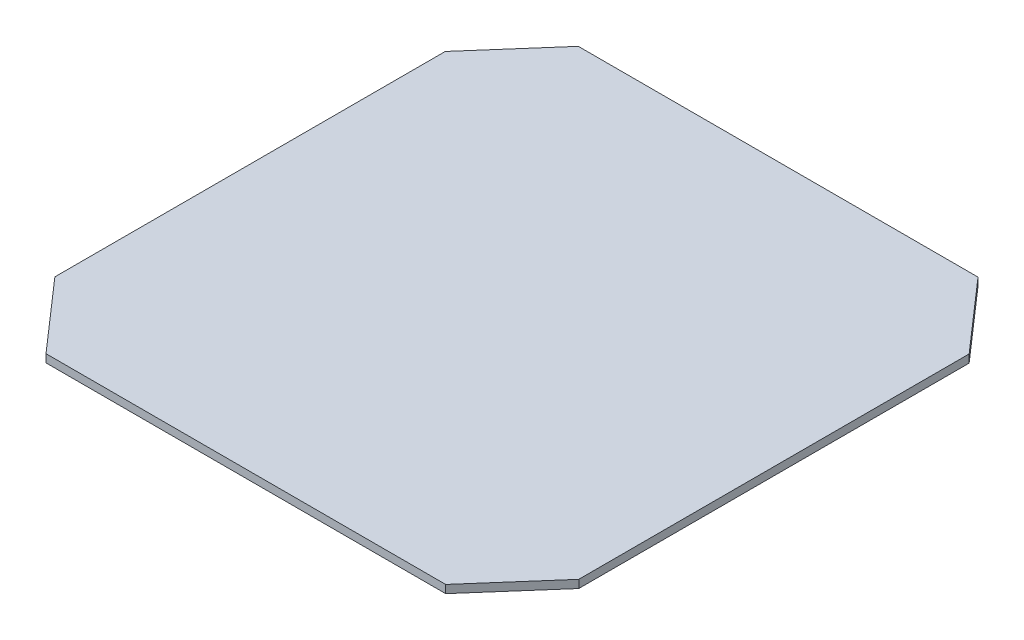
ISO-10303-21;
HEADER;
FILE_DESCRIPTION(('STEP AP214'),'2;1');
FILE_NAME('part.step','',(''),(''),'','','');
FILE_SCHEMA(('AUTOMOTIVE_DESIGN { 1 0 10303 214 1 1 1 1 }'));
ENDSEC;
DATA;
#1=APPLICATION_CONTEXT('core data for automotive mechanical design processes');
#2=APPLICATION_PROTOCOL_DEFINITION('international standard','automotive_design',2000,#1);
#3=PRODUCT_CONTEXT('',#1,'mechanical');
#4=PRODUCT('Part','Part','',(#3));
#5=PRODUCT_RELATED_PRODUCT_CATEGORY('part','',(#4));
#6=PRODUCT_DEFINITION_FORMATION('','',#4);
#7=PRODUCT_DEFINITION_CONTEXT('part definition',#1,'design');
#8=PRODUCT_DEFINITION('design','',#6,#7);
#9=PRODUCT_DEFINITION_SHAPE('','',#8);
#10=(LENGTH_UNIT() NAMED_UNIT(*) SI_UNIT(.MILLI.,.METRE.));
#11=(NAMED_UNIT(*) PLANE_ANGLE_UNIT() SI_UNIT($,.RADIAN.));
#12=(NAMED_UNIT(*) SI_UNIT($,.STERADIAN.) SOLID_ANGLE_UNIT());
#13=UNCERTAINTY_MEASURE_WITH_UNIT(LENGTH_MEASURE(1.E-05),#10,'distance_accuracy_value','');
#14=(GEOMETRIC_REPRESENTATION_CONTEXT(3) GLOBAL_UNCERTAINTY_ASSIGNED_CONTEXT((#13)) GLOBAL_UNIT_ASSIGNED_CONTEXT((#10,
#11,#12)) REPRESENTATION_CONTEXT('',''));
#15=CARTESIAN_POINT('',(0.,0.,0.));
#16=DIRECTION('',(0.,0.,1.));
#17=DIRECTION('',(1.,0.,0.));
#18=AXIS2_PLACEMENT_3D('',#15,#16,#17);
#19=CARTESIAN_POINT('',(-163.846153846154,5.,122.087912087912));
#20=DIRECTION('',(0.752576694706879,0.,-0.658504607868517));
#21=DIRECTION('',(-0.658504607868517,0.,-0.752576694706879));
#22=AXIS2_PLACEMENT_3D('',#19,#20,#21);
#23=PLANE('',#22);
#24=DIRECTION('',(0.658504607868517,0.,0.752576694706879));
#25=VECTOR('',#24,1.);
#26=CARTESIAN_POINT('',(-163.846153846154,0.,122.087912087912));
#27=LINE('',#26,#25);
#28=CARTESIAN_POINT('',(-163.846153846154,0.,122.087912087912));
#29=VERTEX_POINT('',#28);
#30=CARTESIAN_POINT('',(-125.,0.,166.483516483517));
#31=VERTEX_POINT('',#30);
#32=EDGE_CURVE('E146',#29,#31,#27,.T.);
#33=ORIENTED_EDGE('',*,*,#32,.T.);
#34=DIRECTION('',(0.,-1.,0.));
#35=VECTOR('',#34,1.);
#36=CARTESIAN_POINT('',(-125.,5.,166.483516483517));
#37=LINE('',#36,#35);
#38=CARTESIAN_POINT('',(-125.,5.,166.483516483517));
#39=VERTEX_POINT('',#38);
#40=EDGE_CURVE('E11',#39,#31,#37,.T.);
#41=ORIENTED_EDGE('',*,*,#40,.F.);
#42=DIRECTION('',(0.658504607868517,0.,0.752576694706879));
#43=VECTOR('',#42,1.);
#44=CARTESIAN_POINT('',(-163.846153846154,5.,122.087912087912));
#45=LINE('',#44,#43);
#46=CARTESIAN_POINT('',(-163.846153846154,5.,122.087912087912));
#47=VERTEX_POINT('',#46);
#48=EDGE_CURVE('E168',#47,#39,#45,.T.);
#49=ORIENTED_EDGE('',*,*,#48,.F.);
#50=DIRECTION('',(0.,-1.,0.));
#51=VECTOR('',#50,1.);
#52=CARTESIAN_POINT('',(-163.846153846154,5.,122.087912087912));
#53=LINE('',#52,#51);
#54=EDGE_CURVE('E142',#47,#29,#53,.T.);
#55=ORIENTED_EDGE('',*,*,#54,.T.);
#56=EDGE_LOOP('',(#33,#41,#49,#55));
#57=FACE_BOUND('',#56,.T.);
#58=ADVANCED_FACE('F45',(#57),#23,.F.);
#59=CARTESIAN_POINT('',(-125.,5.,166.483516483517));
#60=DIRECTION('',(0.,0.,-1.));
#61=DIRECTION('',(-1.,0.,0.));
#62=AXIS2_PLACEMENT_3D('',#59,#60,#61);
#63=PLANE('',#62);
#64=DIRECTION('',(1.,0.,0.));
#65=VECTOR('',#64,1.);
#66=CARTESIAN_POINT('',(-125.,0.,166.483516483517));
#67=LINE('',#66,#65);
#68=CARTESIAN_POINT('',(125.,0.,166.483516483516));
#69=VERTEX_POINT('',#68);
#70=EDGE_CURVE('E150',#31,#69,#67,.T.);
#71=ORIENTED_EDGE('',*,*,#70,.T.);
#72=DIRECTION('',(0.,-1.,0.));
#73=VECTOR('',#72,1.);
#74=CARTESIAN_POINT('',(125.,5.,166.483516483516));
#75=LINE('',#74,#73);
#76=CARTESIAN_POINT('',(125.,5.,166.483516483516));
#77=VERTEX_POINT('',#76);
#78=EDGE_CURVE('E54',#77,#69,#75,.T.);
#79=ORIENTED_EDGE('',*,*,#78,.F.);
#80=DIRECTION('',(1.,0.,0.));
#81=VECTOR('',#80,1.);
#82=CARTESIAN_POINT('',(-125.,5.,166.483516483517));
#83=LINE('',#82,#81);
#84=EDGE_CURVE('E105',#39,#77,#83,.T.);
#85=ORIENTED_EDGE('',*,*,#84,.F.);
#86=ORIENTED_EDGE('',*,*,#40,.T.);
#87=EDGE_LOOP('',(#71,#79,#85,#86));
#88=FACE_BOUND('',#87,.T.);
#89=ADVANCED_FACE('F214',(#88),#63,.F.);
#90=CARTESIAN_POINT('',(163.846153846154,5.,122.087912087912));
#91=DIRECTION('',(-0.752576694706879,0.,-0.658504607868516));
#92=DIRECTION('',(-0.658504607868516,0.,0.752576694706879));
#93=AXIS2_PLACEMENT_3D('',#90,#91,#92);
#94=PLANE('',#93);
#95=DIRECTION('',(0.658504607868516,0.,-0.75257669470688));
#96=VECTOR('',#95,1.);
#97=CARTESIAN_POINT('',(163.846153846154,0.,122.087912087912));
#98=LINE('',#97,#96);
#99=CARTESIAN_POINT('',(163.846153846154,0.,122.087912087912));
#100=VERTEX_POINT('',#99);
#101=EDGE_CURVE('E153',#69,#100,#98,.T.);
#102=ORIENTED_EDGE('',*,*,#101,.T.);
#103=DIRECTION('',(0.,-1.,0.));
#104=VECTOR('',#103,1.);
#105=CARTESIAN_POINT('',(163.846153846154,5.,122.087912087912));
#106=LINE('',#105,#104);
#107=CARTESIAN_POINT('',(163.846153846154,5.,122.087912087912));
#108=VERTEX_POINT('',#107);
#109=EDGE_CURVE('E179',#108,#100,#106,.T.);
#110=ORIENTED_EDGE('',*,*,#109,.F.);
#111=DIRECTION('',(0.658504607868516,0.,-0.75257669470688));
#112=VECTOR('',#111,1.);
#113=CARTESIAN_POINT('',(163.846153846154,5.,122.087912087912));
#114=LINE('',#113,#112);
#115=EDGE_CURVE('E189',#77,#108,#114,.T.);
#116=ORIENTED_EDGE('',*,*,#115,.F.);
#117=ORIENTED_EDGE('',*,*,#78,.T.);
#118=EDGE_LOOP('',(#102,#110,#116,#117));
#119=FACE_BOUND('',#118,.T.);
#120=ADVANCED_FACE('F187',(#119),#94,.F.);
#121=CARTESIAN_POINT('',(163.846153846154,5.,-122.087912087912));
#122=DIRECTION('',(-1.,0.,0.));
#123=DIRECTION('',(0.,0.,1.));
#124=AXIS2_PLACEMENT_3D('',#121,#122,#123);
#125=PLANE('',#124);
#126=DIRECTION('',(0.,0.,-1.));
#127=VECTOR('',#126,1.);
#128=CARTESIAN_POINT('',(163.846153846154,0.,-122.087912087912));
#129=LINE('',#128,#127);
#130=CARTESIAN_POINT('',(163.846153846154,0.,-122.087912087912));
#131=VERTEX_POINT('',#130);
#132=EDGE_CURVE('E156',#100,#131,#129,.T.);
#133=ORIENTED_EDGE('',*,*,#132,.T.);
#134=DIRECTION('',(0.,-1.,0.));
#135=VECTOR('',#134,1.);
#136=CARTESIAN_POINT('',(163.846153846154,5.,-122.087912087912));
#137=LINE('',#136,#135);
#138=CARTESIAN_POINT('',(163.846153846154,5.,-122.087912087912));
#139=VERTEX_POINT('',#138);
#140=EDGE_CURVE('E175',#139,#131,#137,.T.);
#141=ORIENTED_EDGE('',*,*,#140,.F.);
#142=DIRECTION('',(0.,0.,-1.));
#143=VECTOR('',#142,1.);
#144=CARTESIAN_POINT('',(163.846153846154,5.,-122.087912087912));
#145=LINE('',#144,#143);
#146=EDGE_CURVE('E202',#108,#139,#145,.T.);
#147=ORIENTED_EDGE('',*,*,#146,.F.);
#148=ORIENTED_EDGE('',*,*,#109,.T.);
#149=EDGE_LOOP('',(#133,#141,#147,#148));
#150=FACE_BOUND('',#149,.T.);
#151=ADVANCED_FACE('F197',(#150),#125,.F.);
#152=CARTESIAN_POINT('',(163.846153846154,5.,-122.087912087912));
#153=DIRECTION('',(-0.752576694706879,0.,0.658504607868517));
#154=DIRECTION('',(0.658504607868517,0.,0.752576694706879));
#155=AXIS2_PLACEMENT_3D('',#152,#153,#154);
#156=PLANE('',#155);
#157=DIRECTION('',(-0.658504607868517,0.,-0.752576694706879));
#158=VECTOR('',#157,1.);
#159=CARTESIAN_POINT('',(163.846153846154,0.,-122.087912087912));
#160=LINE('',#159,#158);
#161=CARTESIAN_POINT('',(125.,0.,-166.483516483516));
#162=VERTEX_POINT('',#161);
#163=EDGE_CURVE('E159',#131,#162,#160,.T.);
#164=ORIENTED_EDGE('',*,*,#163,.T.);
#165=DIRECTION('',(0.,-1.,0.));
#166=VECTOR('',#165,1.);
#167=CARTESIAN_POINT('',(125.,5.,-166.483516483516));
#168=LINE('',#167,#166);
#169=CARTESIAN_POINT('',(125.,5.,-166.483516483516));
#170=VERTEX_POINT('',#169);
#171=EDGE_CURVE('E135',#170,#162,#168,.T.);
#172=ORIENTED_EDGE('',*,*,#171,.F.);
#173=DIRECTION('',(-0.658504607868517,0.,-0.752576694706879));
#174=VECTOR('',#173,1.);
#175=CARTESIAN_POINT('',(163.846153846154,5.,-122.087912087912));
#176=LINE('',#175,#174);
#177=EDGE_CURVE('E124',#139,#170,#176,.T.);
#178=ORIENTED_EDGE('',*,*,#177,.F.);
#179=ORIENTED_EDGE('',*,*,#140,.T.);
#180=EDGE_LOOP('',(#164,#172,#178,#179));
#181=FACE_BOUND('',#180,.T.);
#182=ADVANCED_FACE('F200',(#181),#156,.F.);
#183=CARTESIAN_POINT('',(-125.,5.,-166.483516483516));
#184=DIRECTION('',(0.,0.,1.));
#185=DIRECTION('',(1.,0.,0.));
#186=AXIS2_PLACEMENT_3D('',#183,#184,#185);
#187=PLANE('',#186);
#188=DIRECTION('',(-1.,0.,0.));
#189=VECTOR('',#188,1.);
#190=CARTESIAN_POINT('',(-125.,0.,-166.483516483516));
#191=LINE('',#190,#189);
#192=CARTESIAN_POINT('',(-125.,0.,-166.483516483516));
#193=VERTEX_POINT('',#192);
#194=EDGE_CURVE('E133',#162,#193,#191,.T.);
#195=ORIENTED_EDGE('',*,*,#194,.T.);
#196=DIRECTION('',(0.,-1.,0.));
#197=VECTOR('',#196,1.);
#198=CARTESIAN_POINT('',(-125.,5.,-166.483516483516));
#199=LINE('',#198,#197);
#200=CARTESIAN_POINT('',(-125.,5.,-166.483516483516));
#201=VERTEX_POINT('',#200);
#202=EDGE_CURVE('E130',#201,#193,#199,.T.);
#203=ORIENTED_EDGE('',*,*,#202,.F.);
#204=DIRECTION('',(-1.,0.,0.));
#205=VECTOR('',#204,1.);
#206=CARTESIAN_POINT('',(-125.,5.,-166.483516483516));
#207=LINE('',#206,#205);
#208=EDGE_CURVE('E118',#170,#201,#207,.T.);
#209=ORIENTED_EDGE('',*,*,#208,.F.);
#210=ORIENTED_EDGE('',*,*,#171,.T.);
#211=EDGE_LOOP('',(#195,#203,#209,#210));
#212=FACE_BOUND('',#211,.T.);
#213=ADVANCED_FACE('F131',(#212),#187,.F.);
#214=CARTESIAN_POINT('',(-163.846153846154,5.,-122.087912087912));
#215=DIRECTION('',(0.752576694706878,0.,0.658504607868518));
#216=DIRECTION('',(0.658504607868518,0.,-0.752576694706878));
#217=AXIS2_PLACEMENT_3D('',#214,#215,#216);
#218=PLANE('',#217);
#219=DIRECTION('',(-0.658504607868518,0.,0.752576694706878));
#220=VECTOR('',#219,1.);
#221=CARTESIAN_POINT('',(-163.846153846154,0.,-122.087912087912));
#222=LINE('',#221,#220);
#223=CARTESIAN_POINT('',(-163.846153846154,0.,-122.087912087912));
#224=VERTEX_POINT('',#223);
#225=EDGE_CURVE('E91',#193,#224,#222,.T.);
#226=ORIENTED_EDGE('',*,*,#225,.T.);
#227=DIRECTION('',(0.,-1.,0.));
#228=VECTOR('',#227,1.);
#229=CARTESIAN_POINT('',(-163.846153846154,5.,-122.087912087912));
#230=LINE('',#229,#228);
#231=CARTESIAN_POINT('',(-163.846153846154,5.,-122.087912087912));
#232=VERTEX_POINT('',#231);
#233=EDGE_CURVE('E136',#232,#224,#230,.T.);
#234=ORIENTED_EDGE('',*,*,#233,.F.);
#235=DIRECTION('',(-0.658504607868518,0.,0.752576694706878));
#236=VECTOR('',#235,1.);
#237=CARTESIAN_POINT('',(-163.846153846154,5.,-122.087912087912));
#238=LINE('',#237,#236);
#239=EDGE_CURVE('E122',#201,#232,#238,.T.);
#240=ORIENTED_EDGE('',*,*,#239,.F.);
#241=ORIENTED_EDGE('',*,*,#202,.T.);
#242=EDGE_LOOP('',(#226,#234,#240,#241));
#243=FACE_BOUND('',#242,.T.);
#244=ADVANCED_FACE('F138',(#243),#218,.F.);
#245=CARTESIAN_POINT('',(-163.846153846154,5.,-122.087912087912));
#246=DIRECTION('',(1.,0.,0.));
#247=DIRECTION('',(0.,0.,-1.));
#248=AXIS2_PLACEMENT_3D('',#245,#246,#247);
#249=PLANE('',#248);
#250=DIRECTION('',(0.,0.,1.));
#251=VECTOR('',#250,1.);
#252=CARTESIAN_POINT('',(-163.846153846154,0.,-122.087912087912));
#253=LINE('',#252,#251);
#254=EDGE_CURVE('E97',#224,#29,#253,.T.);
#255=ORIENTED_EDGE('',*,*,#254,.T.);
#256=ORIENTED_EDGE('',*,*,#54,.F.);
#257=DIRECTION('',(0.,0.,1.));
#258=VECTOR('',#257,1.);
#259=CARTESIAN_POINT('',(-163.846153846154,5.,-122.087912087912));
#260=LINE('',#259,#258);
#261=EDGE_CURVE('E62',#232,#47,#260,.T.);
#262=ORIENTED_EDGE('',*,*,#261,.F.);
#263=ORIENTED_EDGE('',*,*,#233,.T.);
#264=EDGE_LOOP('',(#255,#256,#262,#263));
#265=FACE_BOUND('',#264,.T.);
#266=ADVANCED_FACE('F230',(#265),#249,.F.);
#267=CARTESIAN_POINT('',(0.,5.,0.));
#268=DIRECTION('',(0.,-1.,0.));
#269=DIRECTION('',(0.,0.,-1.));
#270=AXIS2_PLACEMENT_3D('',#267,#268,#269);
#271=PLANE('',#270);
#272=ORIENTED_EDGE('',*,*,#48,.T.);
#273=ORIENTED_EDGE('',*,*,#84,.T.);
#274=ORIENTED_EDGE('',*,*,#115,.T.);
#275=ORIENTED_EDGE('',*,*,#146,.T.);
#276=ORIENTED_EDGE('',*,*,#177,.T.);
#277=ORIENTED_EDGE('',*,*,#208,.T.);
#278=ORIENTED_EDGE('',*,*,#239,.T.);
#279=ORIENTED_EDGE('',*,*,#261,.T.);
#280=EDGE_LOOP('',(#272,#273,#274,#275,#276,#277,#278,#279));
#281=FACE_BOUND('',#280,.T.);
#282=ADVANCED_FACE('F120',(#281),#271,.F.);
#283=CARTESIAN_POINT('',(0.,0.,0.));
#284=DIRECTION('',(0.,-1.,0.));
#285=DIRECTION('',(0.,0.,-1.));
#286=AXIS2_PLACEMENT_3D('',#283,#284,#285);
#287=PLANE('',#286);
#288=ORIENTED_EDGE('',*,*,#32,.F.);
#289=ORIENTED_EDGE('',*,*,#254,.F.);
#290=ORIENTED_EDGE('',*,*,#225,.F.);
#291=ORIENTED_EDGE('',*,*,#194,.F.);
#292=ORIENTED_EDGE('',*,*,#163,.F.);
#293=ORIENTED_EDGE('',*,*,#132,.F.);
#294=ORIENTED_EDGE('',*,*,#101,.F.);
#295=ORIENTED_EDGE('',*,*,#70,.F.);
#296=EDGE_LOOP('',(#288,#289,#290,#291,#292,#293,#294,#295));
#297=FACE_BOUND('',#296,.T.);
#298=ADVANCED_FACE('F193',(#297),#287,.T.);
#299=CLOSED_SHELL('',(#58,#89,#120,#151,#182,#213,#244,#266,#282,#298));
#300=MANIFOLD_SOLID_BREP('B2',#299);
#301=ADVANCED_BREP_SHAPE_REPRESENTATION('',(#18,#300),#14);
#302=SHAPE_DEFINITION_REPRESENTATION(#9,#301);
ENDSEC;
END-ISO-10303-21;
